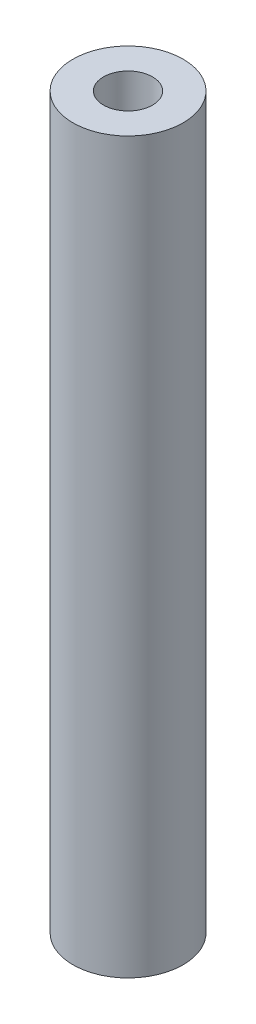
ISO-10303-21;
HEADER;
FILE_DESCRIPTION(('STEP AP214'),'2;1');
FILE_NAME('part.step','',(''),(''),'','','');
FILE_SCHEMA(('AUTOMOTIVE_DESIGN { 1 0 10303 214 1 1 1 1 }'));
ENDSEC;
DATA;
#1=APPLICATION_CONTEXT('core data for automotive mechanical design processes');
#2=APPLICATION_PROTOCOL_DEFINITION('international standard','automotive_design',2000,#1);
#3=PRODUCT_CONTEXT('',#1,'mechanical');
#4=PRODUCT('Part','Part','',(#3));
#5=PRODUCT_RELATED_PRODUCT_CATEGORY('part','',(#4));
#6=PRODUCT_DEFINITION_FORMATION('','',#4);
#7=PRODUCT_DEFINITION_CONTEXT('part definition',#1,'design');
#8=PRODUCT_DEFINITION('design','',#6,#7);
#9=PRODUCT_DEFINITION_SHAPE('','',#8);
#10=(LENGTH_UNIT() NAMED_UNIT(*) SI_UNIT(.MILLI.,.METRE.));
#11=(NAMED_UNIT(*) PLANE_ANGLE_UNIT() SI_UNIT($,.RADIAN.));
#12=(NAMED_UNIT(*) SI_UNIT($,.STERADIAN.) SOLID_ANGLE_UNIT());
#13=UNCERTAINTY_MEASURE_WITH_UNIT(LENGTH_MEASURE(1.E-05),#10,'distance_accuracy_value','');
#14=(GEOMETRIC_REPRESENTATION_CONTEXT(3) GLOBAL_UNCERTAINTY_ASSIGNED_CONTEXT((#13)) GLOBAL_UNIT_ASSIGNED_CONTEXT((#10,
#11,#12)) REPRESENTATION_CONTEXT('',''));
#15=CARTESIAN_POINT('',(0.,0.,0.));
#16=DIRECTION('',(0.,0.,1.));
#17=DIRECTION('',(1.,0.,0.));
#18=AXIS2_PLACEMENT_3D('',#15,#16,#17);
#19=CARTESIAN_POINT('',(0.,35.7,0.));
#20=DIRECTION('',(0.,1.,0.));
#21=DIRECTION('',(0.,0.,1.));
#22=AXIS2_PLACEMENT_3D('',#19,#20,#21);
#23=PLANE('',#22);
#24=CARTESIAN_POINT('',(0.,35.7,0.));
#25=DIRECTION('',(0.,1.,0.));
#26=DIRECTION('',(0.,0.,1.));
#27=AXIS2_PLACEMENT_3D('',#24,#25,#26);
#28=CIRCLE('',#27,2.7);
#29=CARTESIAN_POINT('',(0.,35.7,-2.7));
#30=VERTEX_POINT('',#29);
#31=EDGE_CURVE('E12',#30,#30,#28,.T.);
#32=ORIENTED_EDGE('',*,*,#31,.T.);
#33=EDGE_LOOP('',(#32));
#34=FACE_BOUND('',#33,.T.);
#35=CARTESIAN_POINT('',(0.,35.7,0.));
#36=DIRECTION('',(0.,1.,0.));
#37=DIRECTION('',(0.,0.,1.));
#38=AXIS2_PLACEMENT_3D('',#35,#36,#37);
#39=CIRCLE('',#38,1.2);
#40=CARTESIAN_POINT('',(0.,35.7,-1.2));
#41=VERTEX_POINT('',#40);
#42=EDGE_CURVE('E53',#41,#41,#39,.T.);
#43=ORIENTED_EDGE('',*,*,#42,.F.);
#44=EDGE_LOOP('',(#43));
#45=FACE_BOUND('',#44,.T.);
#46=ADVANCED_FACE('F42',(#34,#45),#23,.T.);
#47=CARTESIAN_POINT('',(0.,0.,0.));
#48=DIRECTION('',(0.,1.,0.));
#49=DIRECTION('',(0.,0.,1.));
#50=AXIS2_PLACEMENT_3D('',#47,#48,#49);
#51=PLANE('',#50);
#52=CARTESIAN_POINT('',(0.,0.,0.));
#53=DIRECTION('',(0.,1.,0.));
#54=DIRECTION('',(0.,0.,1.));
#55=AXIS2_PLACEMENT_3D('',#52,#53,#54);
#56=CIRCLE('',#55,2.7);
#57=CARTESIAN_POINT('',(0.,0.,-2.7));
#58=VERTEX_POINT('',#57);
#59=EDGE_CURVE('E46',#58,#58,#56,.T.);
#60=ORIENTED_EDGE('',*,*,#59,.F.);
#61=EDGE_LOOP('',(#60));
#62=FACE_BOUND('',#61,.T.);
#63=CARTESIAN_POINT('',(0.,0.,0.));
#64=DIRECTION('',(0.,1.,0.));
#65=DIRECTION('',(0.,0.,1.));
#66=AXIS2_PLACEMENT_3D('',#63,#64,#65);
#67=CIRCLE('',#66,1.2);
#68=CARTESIAN_POINT('',(0.,0.,-1.2));
#69=VERTEX_POINT('',#68);
#70=EDGE_CURVE('E55',#69,#69,#67,.T.);
#71=ORIENTED_EDGE('',*,*,#70,.T.);
#72=EDGE_LOOP('',(#71));
#73=FACE_BOUND('',#72,.T.);
#74=ADVANCED_FACE('F65',(#62,#73),#51,.F.);
#75=CARTESIAN_POINT('',(0.,35.7,0.));
#76=DIRECTION('',(0.,-1.,0.));
#77=DIRECTION('',(0.,0.,-1.));
#78=AXIS2_PLACEMENT_3D('',#75,#76,#77);
#79=CYLINDRICAL_SURFACE('',#78,2.7);
#80=CARTESIAN_POINT('',(0.,35.7,-2.7));
#81=CARTESIAN_POINT('',(0.,35.328125,-2.7));
#82=CARTESIAN_POINT('',(0.,34.95625,-2.7));
#83=CARTESIAN_POINT('',(0.,34.2125,-2.7));
#84=CARTESIAN_POINT('',(0.,33.840625,-2.7));
#85=CARTESIAN_POINT('',(0.,33.096875,-2.7));
#86=CARTESIAN_POINT('',(0.,32.725,-2.7));
#87=CARTESIAN_POINT('',(0.,31.98125,-2.7));
#88=CARTESIAN_POINT('',(0.,31.609375,-2.7));
#89=CARTESIAN_POINT('',(0.,30.865625,-2.7));
#90=CARTESIAN_POINT('',(0.,30.49375,-2.7));
#91=CARTESIAN_POINT('',(0.,29.75,-2.7));
#92=CARTESIAN_POINT('',(0.,29.378125,-2.7));
#93=CARTESIAN_POINT('',(0.,28.634375,-2.7));
#94=CARTESIAN_POINT('',(0.,28.2625,-2.7));
#95=CARTESIAN_POINT('',(0.,27.51875,-2.7));
#96=CARTESIAN_POINT('',(0.,27.146875,-2.7));
#97=CARTESIAN_POINT('',(0.,26.403125,-2.7));
#98=CARTESIAN_POINT('',(0.,26.03125,-2.7));
#99=CARTESIAN_POINT('',(0.,25.2875,-2.7));
#100=CARTESIAN_POINT('',(0.,24.915625,-2.7));
#101=CARTESIAN_POINT('',(0.,24.171875,-2.7));
#102=CARTESIAN_POINT('',(0.,23.8,-2.7));
#103=CARTESIAN_POINT('',(0.,23.05625,-2.7));
#104=CARTESIAN_POINT('',(0.,22.684375,-2.7));
#105=CARTESIAN_POINT('',(0.,21.940625,-2.7));
#106=CARTESIAN_POINT('',(0.,21.56875,-2.7));
#107=CARTESIAN_POINT('',(0.,20.825,-2.7));
#108=CARTESIAN_POINT('',(0.,20.453125,-2.7));
#109=CARTESIAN_POINT('',(0.,19.709375,-2.7));
#110=CARTESIAN_POINT('',(0.,19.3375,-2.7));
#111=CARTESIAN_POINT('',(0.,18.59375,-2.7));
#112=CARTESIAN_POINT('',(0.,18.221875,-2.7));
#113=CARTESIAN_POINT('',(0.,17.478125,-2.7));
#114=CARTESIAN_POINT('',(0.,17.10625,-2.7));
#115=CARTESIAN_POINT('',(0.,16.3625,-2.7));
#116=CARTESIAN_POINT('',(0.,15.990625,-2.7));
#117=CARTESIAN_POINT('',(0.,15.246875,-2.7));
#118=CARTESIAN_POINT('',(0.,14.875,-2.7));
#119=CARTESIAN_POINT('',(0.,14.13125,-2.7));
#120=CARTESIAN_POINT('',(0.,13.759375,-2.7));
#121=CARTESIAN_POINT('',(0.,13.015625,-2.7));
#122=CARTESIAN_POINT('',(0.,12.64375,-2.7));
#123=CARTESIAN_POINT('',(0.,11.9,-2.7));
#124=CARTESIAN_POINT('',(0.,11.528125,-2.7));
#125=CARTESIAN_POINT('',(0.,10.784375,-2.7));
#126=CARTESIAN_POINT('',(0.,10.4125,-2.7));
#127=CARTESIAN_POINT('',(0.,9.66875,-2.7));
#128=CARTESIAN_POINT('',(0.,9.296875,-2.7));
#129=CARTESIAN_POINT('',(0.,8.553125,-2.7));
#130=CARTESIAN_POINT('',(0.,8.18125,-2.7));
#131=CARTESIAN_POINT('',(0.,7.4375,-2.7));
#132=CARTESIAN_POINT('',(0.,7.065625,-2.7));
#133=CARTESIAN_POINT('',(0.,6.321875,-2.7));
#134=CARTESIAN_POINT('',(0.,5.95,-2.7));
#135=CARTESIAN_POINT('',(0.,5.20625,-2.7));
#136=CARTESIAN_POINT('',(0.,4.834375,-2.7));
#137=CARTESIAN_POINT('',(0.,4.090625,-2.7));
#138=CARTESIAN_POINT('',(0.,3.71875,-2.7));
#139=CARTESIAN_POINT('',(0.,2.975,-2.7));
#140=CARTESIAN_POINT('',(0.,2.603125,-2.7));
#141=CARTESIAN_POINT('',(0.,1.859375,-2.7));
#142=CARTESIAN_POINT('',(0.,1.4875,-2.7));
#143=CARTESIAN_POINT('',(0.,0.743750000000001,-2.7));
#144=CARTESIAN_POINT('',(0.,0.371875000000001,-2.7));
#145=CARTESIAN_POINT('',(0.,0.,-2.7));
#146=B_SPLINE_CURVE_WITH_KNOTS('',3,(#80,#81,#82,#83,#84,#85,#86,#87,#88,#89,#90,#91,#92,#93,
#94,#95,#96,#97,#98,#99,#100,#101,#102,#103,#104,#105,#106,#107,#108,#109,#110,#111,#112,#113,
#114,#115,#116,#117,#118,#119,#120,#121,#122,#123,#124,#125,#126,#127,#128,#129,#130,#131,#132,
#133,#134,#135,#136,#137,#138,#139,#140,#141,#142,#143,#144,#145),.UNSPECIFIED.,.F.,.F.,(4,2,2,
2,2,2,2,2,2,2,2,2,2,2,2,2,2,2,2,2,2,2,2,2,2,2,2,2,2,2,2,2,4),(0.,1.115625,2.23125,3.346875,
4.46249999999999,5.578125,6.69375,7.809375,8.925,10.040625,11.15625,12.271875,13.3875,14.503125,
15.61875,16.734375,17.85,18.965625,20.08125,21.196875,22.3125,23.428125,24.54375,25.659375,
26.775,27.890625,29.00625,30.121875,31.2375,32.353125,33.46875,34.584375,35.7),.UNSPECIFIED.);
#147=EDGE_CURVE('BSEAM44',#30,#58,#146,.T.);
#148=ORIENTED_EDGE('',*,*,#31,.F.);
#149=ORIENTED_EDGE('',*,*,#59,.T.);
#150=ORIENTED_EDGE('',*,*,#147,.T.);
#151=ORIENTED_EDGE('',*,*,#147,.F.);
#152=EDGE_LOOP('',(#148,#150,#149,#151));
#153=FACE_BOUND('',#152,.T.);
#154=ADVANCED_FACE('F44',(#153),#79,.T.);
#155=CARTESIAN_POINT('',(0.,35.7,0.));
#156=DIRECTION('',(0.,-1.,0.));
#157=DIRECTION('',(0.,0.,-1.));
#158=AXIS2_PLACEMENT_3D('',#155,#156,#157);
#159=CYLINDRICAL_SURFACE('',#158,1.2);
#160=CARTESIAN_POINT('',(0.,35.7,-1.2));
#161=CARTESIAN_POINT('',(0.,35.328125,-1.2));
#162=CARTESIAN_POINT('',(0.,34.95625,-1.2));
#163=CARTESIAN_POINT('',(0.,34.2125,-1.2));
#164=CARTESIAN_POINT('',(0.,33.840625,-1.2));
#165=CARTESIAN_POINT('',(0.,33.096875,-1.2));
#166=CARTESIAN_POINT('',(0.,32.725,-1.2));
#167=CARTESIAN_POINT('',(0.,31.98125,-1.2));
#168=CARTESIAN_POINT('',(0.,31.609375,-1.2));
#169=CARTESIAN_POINT('',(0.,30.865625,-1.2));
#170=CARTESIAN_POINT('',(0.,30.49375,-1.2));
#171=CARTESIAN_POINT('',(0.,29.75,-1.2));
#172=CARTESIAN_POINT('',(0.,29.378125,-1.2));
#173=CARTESIAN_POINT('',(0.,28.634375,-1.2));
#174=CARTESIAN_POINT('',(0.,28.2625,-1.2));
#175=CARTESIAN_POINT('',(0.,27.51875,-1.2));
#176=CARTESIAN_POINT('',(0.,27.146875,-1.2));
#177=CARTESIAN_POINT('',(0.,26.403125,-1.2));
#178=CARTESIAN_POINT('',(0.,26.03125,-1.2));
#179=CARTESIAN_POINT('',(0.,25.2875,-1.2));
#180=CARTESIAN_POINT('',(0.,24.915625,-1.2));
#181=CARTESIAN_POINT('',(0.,24.171875,-1.2));
#182=CARTESIAN_POINT('',(0.,23.8,-1.2));
#183=CARTESIAN_POINT('',(0.,23.05625,-1.2));
#184=CARTESIAN_POINT('',(0.,22.684375,-1.2));
#185=CARTESIAN_POINT('',(0.,21.940625,-1.2));
#186=CARTESIAN_POINT('',(0.,21.56875,-1.2));
#187=CARTESIAN_POINT('',(0.,20.825,-1.2));
#188=CARTESIAN_POINT('',(0.,20.453125,-1.2));
#189=CARTESIAN_POINT('',(0.,19.709375,-1.2));
#190=CARTESIAN_POINT('',(0.,19.3375,-1.2));
#191=CARTESIAN_POINT('',(0.,18.59375,-1.2));
#192=CARTESIAN_POINT('',(0.,18.221875,-1.2));
#193=CARTESIAN_POINT('',(0.,17.478125,-1.2));
#194=CARTESIAN_POINT('',(0.,17.10625,-1.2));
#195=CARTESIAN_POINT('',(0.,16.3625,-1.2));
#196=CARTESIAN_POINT('',(0.,15.990625,-1.2));
#197=CARTESIAN_POINT('',(0.,15.246875,-1.2));
#198=CARTESIAN_POINT('',(0.,14.875,-1.2));
#199=CARTESIAN_POINT('',(0.,14.13125,-1.2));
#200=CARTESIAN_POINT('',(0.,13.759375,-1.2));
#201=CARTESIAN_POINT('',(0.,13.015625,-1.2));
#202=CARTESIAN_POINT('',(0.,12.64375,-1.2));
#203=CARTESIAN_POINT('',(0.,11.9,-1.2));
#204=CARTESIAN_POINT('',(0.,11.528125,-1.2));
#205=CARTESIAN_POINT('',(0.,10.784375,-1.2));
#206=CARTESIAN_POINT('',(0.,10.4125,-1.2));
#207=CARTESIAN_POINT('',(0.,9.66875,-1.2));
#208=CARTESIAN_POINT('',(0.,9.296875,-1.2));
#209=CARTESIAN_POINT('',(0.,8.553125,-1.2));
#210=CARTESIAN_POINT('',(0.,8.18125,-1.2));
#211=CARTESIAN_POINT('',(0.,7.4375,-1.2));
#212=CARTESIAN_POINT('',(0.,7.065625,-1.2));
#213=CARTESIAN_POINT('',(0.,6.321875,-1.2));
#214=CARTESIAN_POINT('',(0.,5.95,-1.2));
#215=CARTESIAN_POINT('',(0.,5.20625,-1.2));
#216=CARTESIAN_POINT('',(0.,4.834375,-1.2));
#217=CARTESIAN_POINT('',(0.,4.090625,-1.2));
#218=CARTESIAN_POINT('',(0.,3.71875,-1.2));
#219=CARTESIAN_POINT('',(0.,2.975,-1.2));
#220=CARTESIAN_POINT('',(0.,2.603125,-1.2));
#221=CARTESIAN_POINT('',(0.,1.859375,-1.2));
#222=CARTESIAN_POINT('',(0.,1.4875,-1.2));
#223=CARTESIAN_POINT('',(0.,0.743750000000001,-1.2));
#224=CARTESIAN_POINT('',(0.,0.371875000000001,-1.2));
#225=CARTESIAN_POINT('',(0.,0.,-1.2));
#226=B_SPLINE_CURVE_WITH_KNOTS('',3,(#160,#161,#162,#163,#164,#165,#166,#167,#168,#169,#170,
#171,#172,#173,#174,#175,#176,#177,#178,#179,#180,#181,#182,#183,#184,#185,#186,#187,#188,#189,
#190,#191,#192,#193,#194,#195,#196,#197,#198,#199,#200,#201,#202,#203,#204,#205,#206,#207,#208,
#209,#210,#211,#212,#213,#214,#215,#216,#217,#218,#219,#220,#221,#222,#223,#224,#225),
.UNSPECIFIED.,.F.,.F.,(4,2,2,2,2,2,2,2,2,2,2,2,2,2,2,2,2,2,2,2,2,2,2,2,2,2,2,2,2,2,2,2,4),(0.,
1.115625,2.23125,3.346875,4.46249999999999,5.578125,6.69375,7.809375,8.925,10.040625,11.15625,
12.271875,13.3875,14.503125,15.61875,16.734375,17.85,18.965625,20.08125,21.196875,22.3125,
23.428125,24.54375,25.659375,26.775,27.890625,29.00625,30.121875,31.2375,32.353125,33.46875,
34.584375,35.7),.UNSPECIFIED.);
#227=EDGE_CURVE('BSEAM61',#41,#69,#226,.T.);
#228=ORIENTED_EDGE('',*,*,#42,.T.);
#229=ORIENTED_EDGE('',*,*,#70,.F.);
#230=ORIENTED_EDGE('',*,*,#227,.T.);
#231=ORIENTED_EDGE('',*,*,#227,.F.);
#232=EDGE_LOOP('',(#228,#230,#229,#231));
#233=FACE_BOUND('',#232,.T.);
#234=ADVANCED_FACE('F61',(#233),#159,.F.);
#235=CLOSED_SHELL('',(#46,#74,#154,#234));
#236=MANIFOLD_SOLID_BREP('B2',#235);
#237=ADVANCED_BREP_SHAPE_REPRESENTATION('',(#18,#236),#14);
#238=SHAPE_DEFINITION_REPRESENTATION(#9,#237);
ENDSEC;
END-ISO-10303-21;
